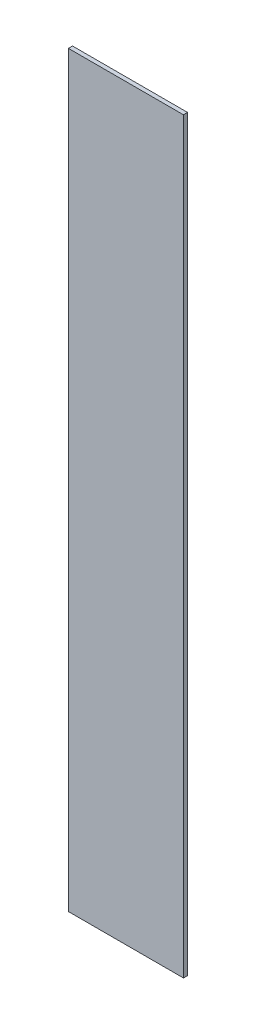
ISO-10303-21;
HEADER;
FILE_DESCRIPTION(('STEP AP214'),'2;1');
FILE_NAME('part.step','',(''),(''),'','','');
FILE_SCHEMA(('AUTOMOTIVE_DESIGN { 1 0 10303 214 1 1 1 1 }'));
ENDSEC;
DATA;
#1=APPLICATION_CONTEXT('core data for automotive mechanical design processes');
#2=APPLICATION_PROTOCOL_DEFINITION('international standard','automotive_design',2000,#1);
#3=PRODUCT_CONTEXT('',#1,'mechanical');
#4=PRODUCT('Part','Part','',(#3));
#5=PRODUCT_RELATED_PRODUCT_CATEGORY('part','',(#4));
#6=PRODUCT_DEFINITION_FORMATION('','',#4);
#7=PRODUCT_DEFINITION_CONTEXT('part definition',#1,'design');
#8=PRODUCT_DEFINITION('design','',#6,#7);
#9=PRODUCT_DEFINITION_SHAPE('','',#8);
#10=(LENGTH_UNIT() NAMED_UNIT(*) SI_UNIT(.MILLI.,.METRE.));
#11=(NAMED_UNIT(*) PLANE_ANGLE_UNIT() SI_UNIT($,.RADIAN.));
#12=(NAMED_UNIT(*) SI_UNIT($,.STERADIAN.) SOLID_ANGLE_UNIT());
#13=UNCERTAINTY_MEASURE_WITH_UNIT(LENGTH_MEASURE(1.E-05),#10,'distance_accuracy_value','');
#14=(GEOMETRIC_REPRESENTATION_CONTEXT(3) GLOBAL_UNCERTAINTY_ASSIGNED_CONTEXT((#13)) GLOBAL_UNIT_ASSIGNED_CONTEXT((#10,
#11,#12)) REPRESENTATION_CONTEXT('',''));
#15=CARTESIAN_POINT('',(0.,0.,0.));
#16=DIRECTION('',(0.,0.,1.));
#17=DIRECTION('',(1.,0.,0.));
#18=AXIS2_PLACEMENT_3D('',#15,#16,#17);
#19=CARTESIAN_POINT('',(623.,1404.,27.));
#20=DIRECTION('',(1.,0.,0.));
#21=DIRECTION('',(0.,0.,-1.));
#22=AXIS2_PLACEMENT_3D('',#19,#20,#21);
#23=PLANE('',#22);
#24=DIRECTION('',(0.,-1.,0.));
#25=VECTOR('',#24,1.);
#26=CARTESIAN_POINT('',(623.,1404.,26.));
#27=LINE('',#26,#25);
#28=CARTESIAN_POINT('',(623.,1586.,26.));
#29=VERTEX_POINT('',#28);
#30=CARTESIAN_POINT('',(623.,1404.,26.));
#31=VERTEX_POINT('',#30);
#32=EDGE_CURVE('E102',#29,#31,#27,.T.);
#33=ORIENTED_EDGE('',*,*,#32,.T.);
#34=DIRECTION('',(0.,0.,-1.));
#35=VECTOR('',#34,1.);
#36=CARTESIAN_POINT('',(623.,1404.,27.));
#37=LINE('',#36,#35);
#38=CARTESIAN_POINT('',(623.,1404.,27.));
#39=VERTEX_POINT('',#38);
#40=EDGE_CURVE('E11',#39,#31,#37,.T.);
#41=ORIENTED_EDGE('',*,*,#40,.F.);
#42=DIRECTION('',(0.,-1.,0.));
#43=VECTOR('',#42,1.);
#44=CARTESIAN_POINT('',(623.,1404.,27.));
#45=LINE('',#44,#43);
#46=CARTESIAN_POINT('',(623.,1586.,27.));
#47=VERTEX_POINT('',#46);
#48=EDGE_CURVE('E90',#47,#39,#45,.T.);
#49=ORIENTED_EDGE('',*,*,#48,.F.);
#50=DIRECTION('',(0.,0.,-1.));
#51=VECTOR('',#50,1.);
#52=CARTESIAN_POINT('',(623.,1586.,27.));
#53=LINE('',#52,#51);
#54=EDGE_CURVE('E98',#47,#29,#53,.T.);
#55=ORIENTED_EDGE('',*,*,#54,.T.);
#56=EDGE_LOOP('',(#33,#41,#49,#55));
#57=FACE_BOUND('',#56,.T.);
#58=ADVANCED_FACE('F39',(#57),#23,.F.);
#59=CARTESIAN_POINT('',(623.,1404.,27.));
#60=DIRECTION('',(0.,1.,0.));
#61=DIRECTION('',(0.,0.,1.));
#62=AXIS2_PLACEMENT_3D('',#59,#60,#61);
#63=PLANE('',#62);
#64=DIRECTION('',(1.,0.,0.));
#65=VECTOR('',#64,1.);
#66=CARTESIAN_POINT('',(623.,1404.,26.));
#67=LINE('',#66,#65);
#68=CARTESIAN_POINT('',(651.,1404.,26.));
#69=VERTEX_POINT('',#68);
#70=EDGE_CURVE('E94',#31,#69,#67,.T.);
#71=ORIENTED_EDGE('',*,*,#70,.T.);
#72=DIRECTION('',(0.,0.,-1.));
#73=VECTOR('',#72,1.);
#74=CARTESIAN_POINT('',(651.,1404.,27.));
#75=LINE('',#74,#73);
#76=CARTESIAN_POINT('',(651.,1404.,27.));
#77=VERTEX_POINT('',#76);
#78=EDGE_CURVE('E47',#77,#69,#75,.T.);
#79=ORIENTED_EDGE('',*,*,#78,.F.);
#80=DIRECTION('',(1.,0.,0.));
#81=VECTOR('',#80,1.);
#82=CARTESIAN_POINT('',(623.,1404.,27.));
#83=LINE('',#82,#81);
#84=EDGE_CURVE('E85',#39,#77,#83,.T.);
#85=ORIENTED_EDGE('',*,*,#84,.F.);
#86=ORIENTED_EDGE('',*,*,#40,.T.);
#87=EDGE_LOOP('',(#71,#79,#85,#86));
#88=FACE_BOUND('',#87,.T.);
#89=ADVANCED_FACE('F93',(#88),#63,.F.);
#90=CARTESIAN_POINT('',(651.,1404.,27.));
#91=DIRECTION('',(-1.,0.,0.));
#92=DIRECTION('',(0.,0.,1.));
#93=AXIS2_PLACEMENT_3D('',#90,#91,#92);
#94=PLANE('',#93);
#95=DIRECTION('',(0.,1.,0.));
#96=VECTOR('',#95,1.);
#97=CARTESIAN_POINT('',(651.,1404.,26.));
#98=LINE('',#97,#96);
#99=CARTESIAN_POINT('',(651.,1586.,26.));
#100=VERTEX_POINT('',#99);
#101=EDGE_CURVE('E72',#69,#100,#98,.T.);
#102=ORIENTED_EDGE('',*,*,#101,.T.);
#103=DIRECTION('',(0.,0.,-1.));
#104=VECTOR('',#103,1.);
#105=CARTESIAN_POINT('',(651.,1586.,27.));
#106=LINE('',#105,#104);
#107=CARTESIAN_POINT('',(651.,1586.,27.));
#108=VERTEX_POINT('',#107);
#109=EDGE_CURVE('E95',#108,#100,#106,.T.);
#110=ORIENTED_EDGE('',*,*,#109,.F.);
#111=DIRECTION('',(0.,1.,0.));
#112=VECTOR('',#111,1.);
#113=CARTESIAN_POINT('',(651.,1404.,27.));
#114=LINE('',#113,#112);
#115=EDGE_CURVE('E88',#77,#108,#114,.T.);
#116=ORIENTED_EDGE('',*,*,#115,.F.);
#117=ORIENTED_EDGE('',*,*,#78,.T.);
#118=EDGE_LOOP('',(#102,#110,#116,#117));
#119=FACE_BOUND('',#118,.T.);
#120=ADVANCED_FACE('F96',(#119),#94,.F.);
#121=CARTESIAN_POINT('',(623.,1586.,27.));
#122=DIRECTION('',(0.,-1.,0.));
#123=DIRECTION('',(0.,0.,-1.));
#124=AXIS2_PLACEMENT_3D('',#121,#122,#123);
#125=PLANE('',#124);
#126=DIRECTION('',(-1.,0.,0.));
#127=VECTOR('',#126,1.);
#128=CARTESIAN_POINT('',(623.,1586.,26.));
#129=LINE('',#128,#127);
#130=EDGE_CURVE('E78',#100,#29,#129,.T.);
#131=ORIENTED_EDGE('',*,*,#130,.T.);
#132=ORIENTED_EDGE('',*,*,#54,.F.);
#133=DIRECTION('',(-1.,0.,0.));
#134=VECTOR('',#133,1.);
#135=CARTESIAN_POINT('',(623.,1586.,27.));
#136=LINE('',#135,#134);
#137=EDGE_CURVE('E55',#108,#47,#136,.T.);
#138=ORIENTED_EDGE('',*,*,#137,.F.);
#139=ORIENTED_EDGE('',*,*,#109,.T.);
#140=EDGE_LOOP('',(#131,#132,#138,#139));
#141=FACE_BOUND('',#140,.T.);
#142=ADVANCED_FACE('F109',(#141),#125,.F.);
#143=CARTESIAN_POINT('',(0.,0.,27.));
#144=DIRECTION('',(0.,0.,-1.));
#145=DIRECTION('',(-1.,0.,0.));
#146=AXIS2_PLACEMENT_3D('',#143,#144,#145);
#147=PLANE('',#146);
#148=ORIENTED_EDGE('',*,*,#48,.T.);
#149=ORIENTED_EDGE('',*,*,#84,.T.);
#150=ORIENTED_EDGE('',*,*,#115,.T.);
#151=ORIENTED_EDGE('',*,*,#137,.T.);
#152=EDGE_LOOP('',(#148,#149,#150,#151));
#153=FACE_BOUND('',#152,.T.);
#154=ADVANCED_FACE('F86',(#153),#147,.F.);
#155=CARTESIAN_POINT('',(0.,0.,26.));
#156=DIRECTION('',(0.,0.,-1.));
#157=DIRECTION('',(-1.,0.,0.));
#158=AXIS2_PLACEMENT_3D('',#155,#156,#157);
#159=PLANE('',#158);
#160=ORIENTED_EDGE('',*,*,#32,.F.);
#161=ORIENTED_EDGE('',*,*,#130,.F.);
#162=ORIENTED_EDGE('',*,*,#101,.F.);
#163=ORIENTED_EDGE('',*,*,#70,.F.);
#164=EDGE_LOOP('',(#160,#161,#162,#163));
#165=FACE_BOUND('',#164,.T.);
#166=ADVANCED_FACE('F112',(#165),#159,.T.);
#167=CLOSED_SHELL('',(#58,#89,#120,#142,#154,#166));
#168=MANIFOLD_SOLID_BREP('B2',#167);
#169=ADVANCED_BREP_SHAPE_REPRESENTATION('',(#18,#168),#14);
#170=SHAPE_DEFINITION_REPRESENTATION(#9,#169);
ENDSEC;
END-ISO-10303-21;
